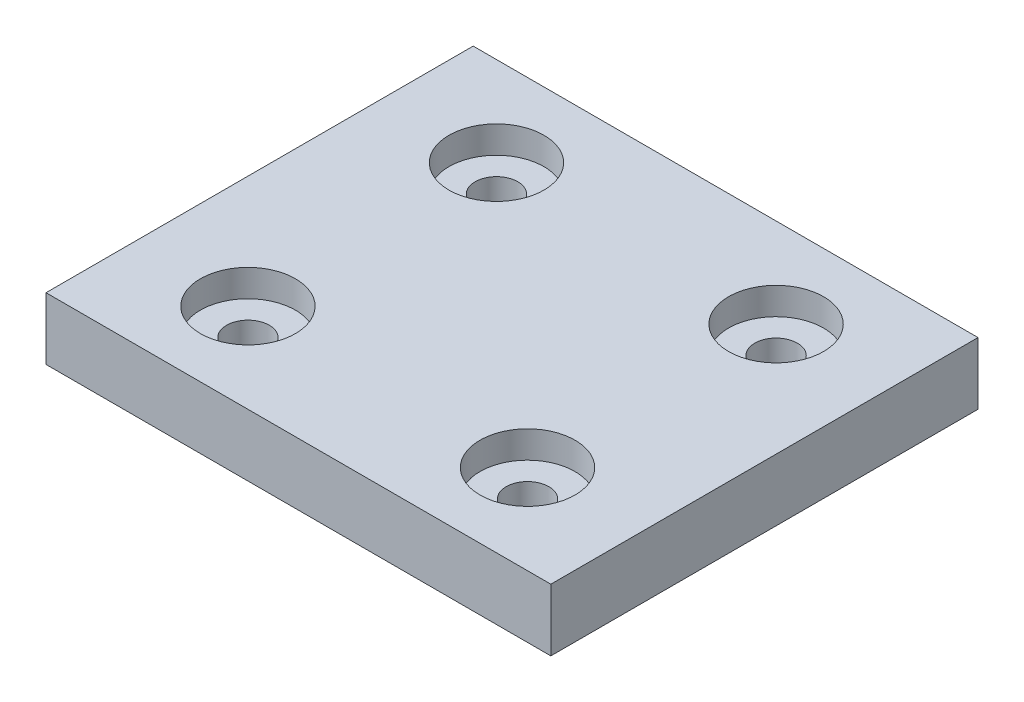
ISO-10303-21;
HEADER;
FILE_DESCRIPTION(('STEP AP214'),'2;1');
FILE_NAME('part.step','',(''),(''),'','','');
FILE_SCHEMA(('AUTOMOTIVE_DESIGN { 1 0 10303 214 1 1 1 1 }'));
ENDSEC;
DATA;
#1=APPLICATION_CONTEXT('core data for automotive mechanical design processes');
#2=APPLICATION_PROTOCOL_DEFINITION('international standard','automotive_design',2000,#1);
#3=PRODUCT_CONTEXT('',#1,'mechanical');
#4=PRODUCT('Part','Part','',(#3));
#5=PRODUCT_RELATED_PRODUCT_CATEGORY('part','',(#4));
#6=PRODUCT_DEFINITION_FORMATION('','',#4);
#7=PRODUCT_DEFINITION_CONTEXT('part definition',#1,'design');
#8=PRODUCT_DEFINITION('design','',#6,#7);
#9=PRODUCT_DEFINITION_SHAPE('','',#8);
#10=(LENGTH_UNIT() NAMED_UNIT(*) SI_UNIT(.MILLI.,.METRE.));
#11=(NAMED_UNIT(*) PLANE_ANGLE_UNIT() SI_UNIT($,.RADIAN.));
#12=(NAMED_UNIT(*) SI_UNIT($,.STERADIAN.) SOLID_ANGLE_UNIT());
#13=UNCERTAINTY_MEASURE_WITH_UNIT(LENGTH_MEASURE(1.E-05),#10,'distance_accuracy_value','');
#14=(GEOMETRIC_REPRESENTATION_CONTEXT(3) GLOBAL_UNCERTAINTY_ASSIGNED_CONTEXT((#13)) GLOBAL_UNIT_ASSIGNED_CONTEXT((#10,
#11,#12)) REPRESENTATION_CONTEXT('',''));
#15=CARTESIAN_POINT('',(0.,0.,0.));
#16=DIRECTION('',(0.,0.,1.));
#17=DIRECTION('',(1.,0.,0.));
#18=AXIS2_PLACEMENT_3D('',#15,#16,#17);
#19=CARTESIAN_POINT('',(32.5,8.,-27.5));
#20=DIRECTION('',(-1.,0.,0.));
#21=DIRECTION('',(0.,0.,1.));
#22=AXIS2_PLACEMENT_3D('',#19,#20,#21);
#23=PLANE('',#22);
#24=DIRECTION('',(0.,0.,-1.));
#25=VECTOR('',#24,1.);
#26=CARTESIAN_POINT('',(32.5,0.,-27.5));
#27=LINE('',#26,#25);
#28=CARTESIAN_POINT('',(32.5,0.,27.5));
#29=VERTEX_POINT('',#28);
#30=CARTESIAN_POINT('',(32.5,0.,-27.5));
#31=VERTEX_POINT('',#30);
#32=EDGE_CURVE('E107',#29,#31,#27,.T.);
#33=ORIENTED_EDGE('',*,*,#32,.T.);
#34=DIRECTION('',(0.,-1.,0.));
#35=VECTOR('',#34,1.);
#36=CARTESIAN_POINT('',(32.5,8.,-27.5));
#37=LINE('',#36,#35);
#38=CARTESIAN_POINT('',(32.5,8.,-27.5));
#39=VERTEX_POINT('',#38);
#40=EDGE_CURVE('E11',#39,#31,#37,.T.);
#41=ORIENTED_EDGE('',*,*,#40,.F.);
#42=DIRECTION('',(0.,0.,-1.));
#43=VECTOR('',#42,1.);
#44=CARTESIAN_POINT('',(32.5,8.,-27.5));
#45=LINE('',#44,#43);
#46=CARTESIAN_POINT('',(32.5,8.,27.5));
#47=VERTEX_POINT('',#46);
#48=EDGE_CURVE('E91',#47,#39,#45,.T.);
#49=ORIENTED_EDGE('',*,*,#48,.F.);
#50=DIRECTION('',(0.,-1.,0.));
#51=VECTOR('',#50,1.);
#52=CARTESIAN_POINT('',(32.5,8.,27.5));
#53=LINE('',#52,#51);
#54=EDGE_CURVE('E103',#47,#29,#53,.T.);
#55=ORIENTED_EDGE('',*,*,#54,.T.);
#56=EDGE_LOOP('',(#33,#41,#49,#55));
#57=FACE_BOUND('',#56,.T.);
#58=ADVANCED_FACE('F39',(#57),#23,.F.);
#59=CARTESIAN_POINT('',(-32.5,8.,-27.5));
#60=DIRECTION('',(0.,0.,1.));
#61=DIRECTION('',(1.,0.,0.));
#62=AXIS2_PLACEMENT_3D('',#59,#60,#61);
#63=PLANE('',#62);
#64=DIRECTION('',(-1.,0.,0.));
#65=VECTOR('',#64,1.);
#66=CARTESIAN_POINT('',(-32.5,0.,-27.5));
#67=LINE('',#66,#65);
#68=CARTESIAN_POINT('',(-32.5,0.,-27.5));
#69=VERTEX_POINT('',#68);
#70=EDGE_CURVE('E96',#31,#69,#67,.T.);
#71=ORIENTED_EDGE('',*,*,#70,.T.);
#72=DIRECTION('',(0.,-1.,0.));
#73=VECTOR('',#72,1.);
#74=CARTESIAN_POINT('',(-32.5,8.,-27.5));
#75=LINE('',#74,#73);
#76=CARTESIAN_POINT('',(-32.5,8.,-27.5));
#77=VERTEX_POINT('',#76);
#78=EDGE_CURVE('E48',#77,#69,#75,.T.);
#79=ORIENTED_EDGE('',*,*,#78,.F.);
#80=DIRECTION('',(-1.,0.,0.));
#81=VECTOR('',#80,1.);
#82=CARTESIAN_POINT('',(-32.5,8.,-27.5));
#83=LINE('',#82,#81);
#84=EDGE_CURVE('E86',#39,#77,#83,.T.);
#85=ORIENTED_EDGE('',*,*,#84,.F.);
#86=ORIENTED_EDGE('',*,*,#40,.T.);
#87=EDGE_LOOP('',(#71,#79,#85,#86));
#88=FACE_BOUND('',#87,.T.);
#89=ADVANCED_FACE('F95',(#88),#63,.F.);
#90=CARTESIAN_POINT('',(-32.5,8.,-27.5));
#91=DIRECTION('',(1.,0.,0.));
#92=DIRECTION('',(0.,0.,-1.));
#93=AXIS2_PLACEMENT_3D('',#90,#91,#92);
#94=PLANE('',#93);
#95=DIRECTION('',(0.,0.,1.));
#96=VECTOR('',#95,1.);
#97=CARTESIAN_POINT('',(-32.5,0.,-27.5));
#98=LINE('',#97,#96);
#99=CARTESIAN_POINT('',(-32.5,0.,27.5));
#100=VERTEX_POINT('',#99);
#101=EDGE_CURVE('E73',#69,#100,#98,.T.);
#102=ORIENTED_EDGE('',*,*,#101,.T.);
#103=DIRECTION('',(0.,-1.,0.));
#104=VECTOR('',#103,1.);
#105=CARTESIAN_POINT('',(-32.5,8.,27.5));
#106=LINE('',#105,#104);
#107=CARTESIAN_POINT('',(-32.5,8.,27.5));
#108=VERTEX_POINT('',#107);
#109=EDGE_CURVE('E98',#108,#100,#106,.T.);
#110=ORIENTED_EDGE('',*,*,#109,.F.);
#111=DIRECTION('',(0.,0.,1.));
#112=VECTOR('',#111,1.);
#113=CARTESIAN_POINT('',(-32.5,8.,-27.5));
#114=LINE('',#113,#112);
#115=EDGE_CURVE('E89',#77,#108,#114,.T.);
#116=ORIENTED_EDGE('',*,*,#115,.F.);
#117=ORIENTED_EDGE('',*,*,#78,.T.);
#118=EDGE_LOOP('',(#102,#110,#116,#117));
#119=FACE_BOUND('',#118,.T.);
#120=ADVANCED_FACE('F99',(#119),#94,.F.);
#121=CARTESIAN_POINT('',(-32.5,8.,27.5));
#122=DIRECTION('',(0.,0.,-1.));
#123=DIRECTION('',(-1.,0.,0.));
#124=AXIS2_PLACEMENT_3D('',#121,#122,#123);
#125=PLANE('',#124);
#126=DIRECTION('',(1.,0.,0.));
#127=VECTOR('',#126,1.);
#128=CARTESIAN_POINT('',(-32.5,0.,27.5));
#129=LINE('',#128,#127);
#130=EDGE_CURVE('E79',#100,#29,#129,.T.);
#131=ORIENTED_EDGE('',*,*,#130,.T.);
#132=ORIENTED_EDGE('',*,*,#54,.F.);
#133=DIRECTION('',(1.,0.,0.));
#134=VECTOR('',#133,1.);
#135=CARTESIAN_POINT('',(-32.5,8.,27.5));
#136=LINE('',#135,#134);
#137=EDGE_CURVE('E56',#108,#47,#136,.T.);
#138=ORIENTED_EDGE('',*,*,#137,.F.);
#139=ORIENTED_EDGE('',*,*,#109,.T.);
#140=EDGE_LOOP('',(#131,#132,#138,#139));
#141=FACE_BOUND('',#140,.T.);
#142=ADVANCED_FACE('F121',(#141),#125,.F.);
#143=CARTESIAN_POINT('',(0.,8.,0.));
#144=DIRECTION('',(0.,1.,0.));
#145=DIRECTION('',(0.,0.,1.));
#146=AXIS2_PLACEMENT_3D('',#143,#144,#145);
#147=PLANE('',#146);
#148=CARTESIAN_POINT('',(-18.,8.,-16.));
#149=DIRECTION('',(0.,1.,0.));
#150=DIRECTION('',(0.,0.,1.));
#151=AXIS2_PLACEMENT_3D('',#148,#149,#150);
#152=CIRCLE('',#151,6.119);
#153=CARTESIAN_POINT('',(-18.,8.,-9.881));
#154=VERTEX_POINT('',#153);
#155=EDGE_CURVE('E187',#154,#154,#152,.T.);
#156=ORIENTED_EDGE('',*,*,#155,.F.);
#157=EDGE_LOOP('',(#156));
#158=FACE_BOUND('',#157,.T.);
#159=CARTESIAN_POINT('',(18.,8.,-16.));
#160=DIRECTION('',(0.,1.,0.));
#161=DIRECTION('',(0.,0.,1.));
#162=AXIS2_PLACEMENT_3D('',#159,#160,#161);
#163=CIRCLE('',#162,6.119);
#164=CARTESIAN_POINT('',(18.,8.,-9.881));
#165=VERTEX_POINT('',#164);
#166=EDGE_CURVE('E171',#165,#165,#163,.T.);
#167=ORIENTED_EDGE('',*,*,#166,.F.);
#168=EDGE_LOOP('',(#167));
#169=FACE_BOUND('',#168,.T.);
#170=CARTESIAN_POINT('',(18.,8.,16.));
#171=DIRECTION('',(0.,1.,0.));
#172=DIRECTION('',(0.,0.,1.));
#173=AXIS2_PLACEMENT_3D('',#170,#171,#172);
#174=CIRCLE('',#173,6.119);
#175=CARTESIAN_POINT('',(18.,8.,22.119));
#176=VERTEX_POINT('',#175);
#177=EDGE_CURVE('E155',#176,#176,#174,.T.);
#178=ORIENTED_EDGE('',*,*,#177,.F.);
#179=EDGE_LOOP('',(#178));
#180=FACE_BOUND('',#179,.T.);
#181=CARTESIAN_POINT('',(-18.,8.,16.));
#182=DIRECTION('',(0.,1.,0.));
#183=DIRECTION('',(0.,0.,1.));
#184=AXIS2_PLACEMENT_3D('',#181,#182,#183);
#185=CIRCLE('',#184,6.119);
#186=CARTESIAN_POINT('',(-18.,8.,22.119));
#187=VERTEX_POINT('',#186);
#188=EDGE_CURVE('E139',#187,#187,#185,.T.);
#189=ORIENTED_EDGE('',*,*,#188,.F.);
#190=EDGE_LOOP('',(#189));
#191=FACE_BOUND('',#190,.T.);
#192=ORIENTED_EDGE('',*,*,#48,.T.);
#193=ORIENTED_EDGE('',*,*,#84,.T.);
#194=ORIENTED_EDGE('',*,*,#115,.T.);
#195=ORIENTED_EDGE('',*,*,#137,.T.);
#196=EDGE_LOOP('',(#192,#193,#194,#195));
#197=FACE_BOUND('',#196,.T.);
#198=ADVANCED_FACE('F87',(#158,#169,#180,#191,#197),#147,.T.);
#199=CARTESIAN_POINT('',(0.,0.,0.));
#200=DIRECTION('',(0.,1.,0.));
#201=DIRECTION('',(0.,0.,1.));
#202=AXIS2_PLACEMENT_3D('',#199,#200,#201);
#203=PLANE('',#202);
#204=CARTESIAN_POINT('',(-18.,0.,-16.));
#205=DIRECTION('',(0.,1.,0.));
#206=DIRECTION('',(0.,0.,1.));
#207=AXIS2_PLACEMENT_3D('',#204,#205,#206);
#208=CIRCLE('',#207,2.75);
#209=CARTESIAN_POINT('',(-18.,0.,-13.25));
#210=VERTEX_POINT('',#209);
#211=EDGE_CURVE('E175',#210,#210,#208,.T.);
#212=ORIENTED_EDGE('',*,*,#211,.T.);
#213=EDGE_LOOP('',(#212));
#214=FACE_BOUND('',#213,.T.);
#215=CARTESIAN_POINT('',(18.,0.,-16.));
#216=DIRECTION('',(0.,1.,0.));
#217=DIRECTION('',(0.,0.,1.));
#218=AXIS2_PLACEMENT_3D('',#215,#216,#217);
#219=CIRCLE('',#218,2.75);
#220=CARTESIAN_POINT('',(18.,0.,-13.25));
#221=VERTEX_POINT('',#220);
#222=EDGE_CURVE('E159',#221,#221,#219,.T.);
#223=ORIENTED_EDGE('',*,*,#222,.T.);
#224=EDGE_LOOP('',(#223));
#225=FACE_BOUND('',#224,.T.);
#226=CARTESIAN_POINT('',(18.,0.,16.));
#227=DIRECTION('',(0.,1.,0.));
#228=DIRECTION('',(0.,0.,1.));
#229=AXIS2_PLACEMENT_3D('',#226,#227,#228);
#230=CIRCLE('',#229,2.75);
#231=CARTESIAN_POINT('',(18.,0.,18.75));
#232=VERTEX_POINT('',#231);
#233=EDGE_CURVE('E143',#232,#232,#230,.T.);
#234=ORIENTED_EDGE('',*,*,#233,.T.);
#235=EDGE_LOOP('',(#234));
#236=FACE_BOUND('',#235,.T.);
#237=CARTESIAN_POINT('',(-18.,0.,16.));
#238=DIRECTION('',(0.,1.,0.));
#239=DIRECTION('',(0.,0.,1.));
#240=AXIS2_PLACEMENT_3D('',#237,#238,#239);
#241=CIRCLE('',#240,2.75);
#242=CARTESIAN_POINT('',(-18.,0.,18.75));
#243=VERTEX_POINT('',#242);
#244=EDGE_CURVE('E111',#243,#243,#241,.T.);
#245=ORIENTED_EDGE('',*,*,#244,.T.);
#246=EDGE_LOOP('',(#245));
#247=FACE_BOUND('',#246,.T.);
#248=ORIENTED_EDGE('',*,*,#32,.F.);
#249=ORIENTED_EDGE('',*,*,#130,.F.);
#250=ORIENTED_EDGE('',*,*,#101,.F.);
#251=ORIENTED_EDGE('',*,*,#70,.F.);
#252=EDGE_LOOP('',(#248,#249,#250,#251));
#253=FACE_BOUND('',#252,.T.);
#254=ADVANCED_FACE('F124',(#214,#225,#236,#247,#253),#203,.F.);
#255=CARTESIAN_POINT('',(-18.,8.,16.));
#256=DIRECTION('',(0.,1.,0.));
#257=DIRECTION('',(0.,0.,1.));
#258=AXIS2_PLACEMENT_3D('',#255,#256,#257);
#259=CYLINDRICAL_SURFACE('',#258,2.75);
#260=ORIENTED_EDGE('',*,*,#244,.F.);
#261=EDGE_LOOP('',(#260));
#262=FACE_BOUND('',#261,.T.);
#263=CARTESIAN_POINT('',(-18.,4.5,16.));
#264=DIRECTION('',(0.,1.,0.));
#265=DIRECTION('',(0.,0.,1.));
#266=AXIS2_PLACEMENT_3D('',#263,#264,#265);
#267=CIRCLE('',#266,2.75);
#268=CARTESIAN_POINT('',(-18.,4.5,18.75));
#269=VERTEX_POINT('',#268);
#270=EDGE_CURVE('E131',#269,#269,#267,.T.);
#271=ORIENTED_EDGE('',*,*,#270,.T.);
#272=EDGE_LOOP('',(#271));
#273=FACE_BOUND('',#272,.T.);
#274=ADVANCED_FACE('F216',(#262,#273),#259,.F.);
#275=CARTESIAN_POINT('',(-15.25,4.5,16.));
#276=DIRECTION('',(0.,-1.,0.));
#277=DIRECTION('',(0.,0.,-1.));
#278=AXIS2_PLACEMENT_3D('',#275,#276,#277);
#279=PLANE('',#278);
#280=ORIENTED_EDGE('',*,*,#270,.F.);
#281=EDGE_LOOP('',(#280));
#282=FACE_BOUND('',#281,.T.);
#283=CARTESIAN_POINT('',(-18.,4.5,16.));
#284=DIRECTION('',(0.,1.,0.));
#285=DIRECTION('',(0.,0.,1.));
#286=AXIS2_PLACEMENT_3D('',#283,#284,#285);
#287=CIRCLE('',#286,6.119);
#288=CARTESIAN_POINT('',(-18.,4.5,22.119));
#289=VERTEX_POINT('',#288);
#290=EDGE_CURVE('E135',#289,#289,#287,.T.);
#291=ORIENTED_EDGE('',*,*,#290,.T.);
#292=EDGE_LOOP('',(#291));
#293=FACE_BOUND('',#292,.T.);
#294=ADVANCED_FACE('F206',(#282,#293),#279,.F.);
#295=CARTESIAN_POINT('',(-18.,8.,16.));
#296=DIRECTION('',(0.,1.,0.));
#297=DIRECTION('',(0.,0.,1.));
#298=AXIS2_PLACEMENT_3D('',#295,#296,#297);
#299=CYLINDRICAL_SURFACE('',#298,6.119);
#300=ORIENTED_EDGE('',*,*,#290,.F.);
#301=EDGE_LOOP('',(#300));
#302=FACE_BOUND('',#301,.T.);
#303=ORIENTED_EDGE('',*,*,#188,.T.);
#304=EDGE_LOOP('',(#303));
#305=FACE_BOUND('',#304,.T.);
#306=ADVANCED_FACE('F203',(#302,#305),#299,.F.);
#307=CARTESIAN_POINT('',(18.,8.,16.));
#308=DIRECTION('',(0.,1.,0.));
#309=DIRECTION('',(0.,0.,1.));
#310=AXIS2_PLACEMENT_3D('',#307,#308,#309);
#311=CYLINDRICAL_SURFACE('',#310,2.75);
#312=ORIENTED_EDGE('',*,*,#233,.F.);
#313=EDGE_LOOP('',(#312));
#314=FACE_BOUND('',#313,.T.);
#315=CARTESIAN_POINT('',(18.,4.5,16.));
#316=DIRECTION('',(0.,1.,0.));
#317=DIRECTION('',(0.,0.,1.));
#318=AXIS2_PLACEMENT_3D('',#315,#316,#317);
#319=CIRCLE('',#318,2.75);
#320=CARTESIAN_POINT('',(18.,4.5,18.75));
#321=VERTEX_POINT('',#320);
#322=EDGE_CURVE('E147',#321,#321,#319,.T.);
#323=ORIENTED_EDGE('',*,*,#322,.T.);
#324=EDGE_LOOP('',(#323));
#325=FACE_BOUND('',#324,.T.);
#326=ADVANCED_FACE('F205',(#314,#325),#311,.F.);
#327=CARTESIAN_POINT('',(20.75,4.5,16.));
#328=DIRECTION('',(0.,-1.,0.));
#329=DIRECTION('',(0.,0.,-1.));
#330=AXIS2_PLACEMENT_3D('',#327,#328,#329);
#331=PLANE('',#330);
#332=ORIENTED_EDGE('',*,*,#322,.F.);
#333=EDGE_LOOP('',(#332));
#334=FACE_BOUND('',#333,.T.);
#335=CARTESIAN_POINT('',(18.,4.5,16.));
#336=DIRECTION('',(0.,1.,0.));
#337=DIRECTION('',(0.,0.,1.));
#338=AXIS2_PLACEMENT_3D('',#335,#336,#337);
#339=CIRCLE('',#338,6.119);
#340=CARTESIAN_POINT('',(18.,4.5,22.119));
#341=VERTEX_POINT('',#340);
#342=EDGE_CURVE('E151',#341,#341,#339,.T.);
#343=ORIENTED_EDGE('',*,*,#342,.T.);
#344=EDGE_LOOP('',(#343));
#345=FACE_BOUND('',#344,.T.);
#346=ADVANCED_FACE('F213',(#334,#345),#331,.F.);
#347=CARTESIAN_POINT('',(18.,8.,16.));
#348=DIRECTION('',(0.,1.,0.));
#349=DIRECTION('',(0.,0.,1.));
#350=AXIS2_PLACEMENT_3D('',#347,#348,#349);
#351=CYLINDRICAL_SURFACE('',#350,6.119);
#352=ORIENTED_EDGE('',*,*,#342,.F.);
#353=EDGE_LOOP('',(#352));
#354=FACE_BOUND('',#353,.T.);
#355=ORIENTED_EDGE('',*,*,#177,.T.);
#356=EDGE_LOOP('',(#355));
#357=FACE_BOUND('',#356,.T.);
#358=ADVANCED_FACE('F268',(#354,#357),#351,.F.);
#359=CARTESIAN_POINT('',(18.,8.,-16.));
#360=DIRECTION('',(0.,1.,0.));
#361=DIRECTION('',(0.,0.,1.));
#362=AXIS2_PLACEMENT_3D('',#359,#360,#361);
#363=CYLINDRICAL_SURFACE('',#362,2.75);
#364=ORIENTED_EDGE('',*,*,#222,.F.);
#365=EDGE_LOOP('',(#364));
#366=FACE_BOUND('',#365,.T.);
#367=CARTESIAN_POINT('',(18.,4.5,-16.));
#368=DIRECTION('',(0.,1.,0.));
#369=DIRECTION('',(0.,0.,1.));
#370=AXIS2_PLACEMENT_3D('',#367,#368,#369);
#371=CIRCLE('',#370,2.75);
#372=CARTESIAN_POINT('',(18.,4.5,-13.25));
#373=VERTEX_POINT('',#372);
#374=EDGE_CURVE('E163',#373,#373,#371,.T.);
#375=ORIENTED_EDGE('',*,*,#374,.T.);
#376=EDGE_LOOP('',(#375));
#377=FACE_BOUND('',#376,.T.);
#378=ADVANCED_FACE('F278',(#366,#377),#363,.F.);
#379=CARTESIAN_POINT('',(20.75,4.5,-16.));
#380=DIRECTION('',(0.,-1.,0.));
#381=DIRECTION('',(0.,0.,-1.));
#382=AXIS2_PLACEMENT_3D('',#379,#380,#381);
#383=PLANE('',#382);
#384=ORIENTED_EDGE('',*,*,#374,.F.);
#385=EDGE_LOOP('',(#384));
#386=FACE_BOUND('',#385,.T.);
#387=CARTESIAN_POINT('',(18.,4.5,-16.));
#388=DIRECTION('',(0.,1.,0.));
#389=DIRECTION('',(0.,0.,1.));
#390=AXIS2_PLACEMENT_3D('',#387,#388,#389);
#391=CIRCLE('',#390,6.119);
#392=CARTESIAN_POINT('',(18.,4.5,-9.881));
#393=VERTEX_POINT('',#392);
#394=EDGE_CURVE('E167',#393,#393,#391,.T.);
#395=ORIENTED_EDGE('',*,*,#394,.T.);
#396=EDGE_LOOP('',(#395));
#397=FACE_BOUND('',#396,.T.);
#398=ADVANCED_FACE('F288',(#386,#397),#383,.F.);
#399=CARTESIAN_POINT('',(18.,8.,-16.));
#400=DIRECTION('',(0.,1.,0.));
#401=DIRECTION('',(0.,0.,1.));
#402=AXIS2_PLACEMENT_3D('',#399,#400,#401);
#403=CYLINDRICAL_SURFACE('',#402,6.119);
#404=ORIENTED_EDGE('',*,*,#394,.F.);
#405=EDGE_LOOP('',(#404));
#406=FACE_BOUND('',#405,.T.);
#407=ORIENTED_EDGE('',*,*,#166,.T.);
#408=EDGE_LOOP('',(#407));
#409=FACE_BOUND('',#408,.T.);
#410=ADVANCED_FACE('F298',(#406,#409),#403,.F.);
#411=CARTESIAN_POINT('',(-18.,8.,-16.));
#412=DIRECTION('',(0.,1.,0.));
#413=DIRECTION('',(0.,0.,1.));
#414=AXIS2_PLACEMENT_3D('',#411,#412,#413);
#415=CYLINDRICAL_SURFACE('',#414,2.75);
#416=ORIENTED_EDGE('',*,*,#211,.F.);
#417=EDGE_LOOP('',(#416));
#418=FACE_BOUND('',#417,.T.);
#419=CARTESIAN_POINT('',(-18.,4.5,-16.));
#420=DIRECTION('',(0.,1.,0.));
#421=DIRECTION('',(0.,0.,1.));
#422=AXIS2_PLACEMENT_3D('',#419,#420,#421);
#423=CIRCLE('',#422,2.75);
#424=CARTESIAN_POINT('',(-18.,4.5,-13.25));
#425=VERTEX_POINT('',#424);
#426=EDGE_CURVE('E179',#425,#425,#423,.T.);
#427=ORIENTED_EDGE('',*,*,#426,.T.);
#428=EDGE_LOOP('',(#427));
#429=FACE_BOUND('',#428,.T.);
#430=ADVANCED_FACE('F308',(#418,#429),#415,.F.);
#431=CARTESIAN_POINT('',(-15.25,4.5,-16.));
#432=DIRECTION('',(0.,-1.,0.));
#433=DIRECTION('',(0.,0.,-1.));
#434=AXIS2_PLACEMENT_3D('',#431,#432,#433);
#435=PLANE('',#434);
#436=ORIENTED_EDGE('',*,*,#426,.F.);
#437=EDGE_LOOP('',(#436));
#438=FACE_BOUND('',#437,.T.);
#439=CARTESIAN_POINT('',(-18.,4.5,-16.));
#440=DIRECTION('',(0.,1.,0.));
#441=DIRECTION('',(0.,0.,1.));
#442=AXIS2_PLACEMENT_3D('',#439,#440,#441);
#443=CIRCLE('',#442,6.119);
#444=CARTESIAN_POINT('',(-18.,4.5,-9.881));
#445=VERTEX_POINT('',#444);
#446=EDGE_CURVE('E183',#445,#445,#443,.T.);
#447=ORIENTED_EDGE('',*,*,#446,.T.);
#448=EDGE_LOOP('',(#447));
#449=FACE_BOUND('',#448,.T.);
#450=ADVANCED_FACE('F318',(#438,#449),#435,.F.);
#451=CARTESIAN_POINT('',(-18.,8.,-16.));
#452=DIRECTION('',(0.,1.,0.));
#453=DIRECTION('',(0.,0.,1.));
#454=AXIS2_PLACEMENT_3D('',#451,#452,#453);
#455=CYLINDRICAL_SURFACE('',#454,6.119);
#456=ORIENTED_EDGE('',*,*,#446,.F.);
#457=EDGE_LOOP('',(#456));
#458=FACE_BOUND('',#457,.T.);
#459=ORIENTED_EDGE('',*,*,#155,.T.);
#460=EDGE_LOOP('',(#459));
#461=FACE_BOUND('',#460,.T.);
#462=ADVANCED_FACE('F192',(#458,#461),#455,.F.);
#463=CLOSED_SHELL('',(#58,#89,#120,#142,#198,#254,#274,#294,#306,#326,#346,#358,#378,#398,#410,
#430,#450,#462));
#464=MANIFOLD_SOLID_BREP('B2',#463);
#465=ADVANCED_BREP_SHAPE_REPRESENTATION('',(#18,#464),#14);
#466=SHAPE_DEFINITION_REPRESENTATION(#9,#465);
ENDSEC;
END-ISO-10303-21;
